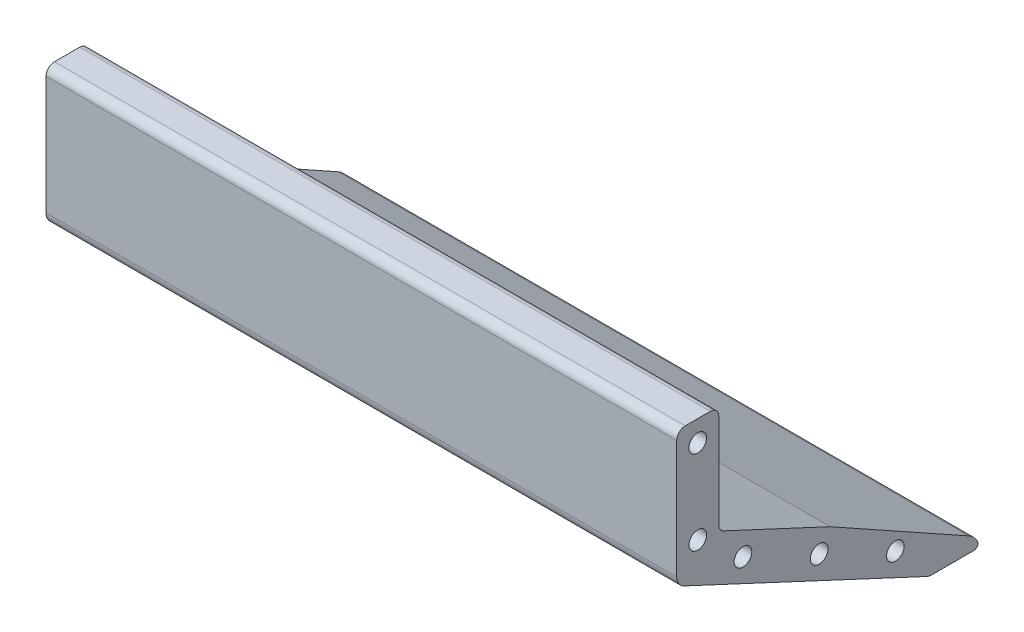
ISO-10303-21;
HEADER;
FILE_DESCRIPTION(('STEP AP214'),'2;1');
FILE_NAME('part.step','',(''),(''),'','','');
FILE_SCHEMA(('AUTOMOTIVE_DESIGN { 1 0 10303 214 1 1 1 1 }'));
ENDSEC;
DATA;
#1=APPLICATION_CONTEXT('core data for automotive mechanical design processes');
#2=APPLICATION_PROTOCOL_DEFINITION('international standard','automotive_design',2000,#1);
#3=PRODUCT_CONTEXT('',#1,'mechanical');
#4=PRODUCT('Part','Part','',(#3));
#5=PRODUCT_RELATED_PRODUCT_CATEGORY('part','',(#4));
#6=PRODUCT_DEFINITION_FORMATION('','',#4);
#7=PRODUCT_DEFINITION_CONTEXT('part definition',#1,'design');
#8=PRODUCT_DEFINITION('design','',#6,#7);
#9=PRODUCT_DEFINITION_SHAPE('','',#8);
#10=(LENGTH_UNIT() NAMED_UNIT(*) SI_UNIT(.MILLI.,.METRE.));
#11=(NAMED_UNIT(*) PLANE_ANGLE_UNIT() SI_UNIT($,.RADIAN.));
#12=(NAMED_UNIT(*) SI_UNIT($,.STERADIAN.) SOLID_ANGLE_UNIT());
#13=UNCERTAINTY_MEASURE_WITH_UNIT(LENGTH_MEASURE(1.E-05),#10,'distance_accuracy_value','');
#14=(GEOMETRIC_REPRESENTATION_CONTEXT(3) GLOBAL_UNCERTAINTY_ASSIGNED_CONTEXT((#13)) GLOBAL_UNIT_ASSIGNED_CONTEXT((#10,
#11,#12)) REPRESENTATION_CONTEXT('',''));
#15=CARTESIAN_POINT('',(0.,0.,0.));
#16=DIRECTION('',(0.,0.,1.));
#17=DIRECTION('',(1.,0.,0.));
#18=AXIS2_PLACEMENT_3D('',#15,#16,#17);
#19=CARTESIAN_POINT('',(147.,0.,0.));
#20=DIRECTION('',(1.,0.,0.));
#21=DIRECTION('',(0.,0.,-1.));
#22=AXIS2_PLACEMENT_3D('',#19,#20,#21);
#23=PLANE('',#22);
#24=CARTESIAN_POINT('',(147.,-15.,55.));
#25=DIRECTION('',(1.,0.,0.));
#26=DIRECTION('',(0.,0.,-1.));
#27=AXIS2_PLACEMENT_3D('',#24,#25,#26);
#28=CIRCLE('',#27,2.1);
#29=CARTESIAN_POINT('',(147.,-15.,52.9));
#30=VERTEX_POINT('',#29);
#31=EDGE_CURVE('E186',#30,#30,#28,.T.);
#32=ORIENTED_EDGE('',*,*,#31,.F.);
#33=EDGE_LOOP('',(#32));
#34=FACE_BOUND('',#33,.T.);
#35=CARTESIAN_POINT('',(147.,-43.8479186703194,44.2523114814659));
#36=DIRECTION('',(1.,0.,0.));
#37=DIRECTION('',(0.,0.,-1.));
#38=AXIS2_PLACEMENT_3D('',#35,#36,#37);
#39=CIRCLE('',#38,2.1);
#40=CARTESIAN_POINT('',(147.,-43.8479186703194,42.1523114814659));
#41=VERTEX_POINT('',#40);
#42=EDGE_CURVE('E176',#41,#41,#39,.T.);
#43=ORIENTED_EDGE('',*,*,#42,.F.);
#44=EDGE_LOOP('',(#43));
#45=FACE_BOUND('',#44,.T.);
#46=CARTESIAN_POINT('',(147.,-52.3002839051334,26.126155740733));
#47=DIRECTION('',(1.,0.,0.));
#48=DIRECTION('',(0.,0.,-1.));
#49=AXIS2_PLACEMENT_3D('',#46,#47,#48);
#50=CIRCLE('',#49,2.1);
#51=CARTESIAN_POINT('',(147.,-52.3002839051334,24.026155740733));
#52=VERTEX_POINT('',#51);
#53=EDGE_CURVE('E180',#52,#52,#50,.T.);
#54=ORIENTED_EDGE('',*,*,#53,.F.);
#55=EDGE_LOOP('',(#54));
#56=FACE_BOUND('',#55,.T.);
#57=CARTESIAN_POINT('',(147.,-35.,54.9999999999998));
#58=DIRECTION('',(1.,0.,0.));
#59=DIRECTION('',(0.,0.,-1.));
#60=AXIS2_PLACEMENT_3D('',#57,#58,#59);
#61=CIRCLE('',#60,2.1);
#62=CARTESIAN_POINT('',(147.,-35.,52.8999999999998));
#63=VERTEX_POINT('',#62);
#64=EDGE_CURVE('E189',#63,#63,#61,.T.);
#65=ORIENTED_EDGE('',*,*,#64,.F.);
#66=EDGE_LOOP('',(#65));
#67=FACE_BOUND('',#66,.T.);
#68=CARTESIAN_POINT('',(147.,-60.7526491399475,7.99999999999999));
#69=DIRECTION('',(1.,0.,0.));
#70=DIRECTION('',(0.,0.,-1.));
#71=AXIS2_PLACEMENT_3D('',#68,#69,#70);
#72=CIRCLE('',#71,2.1);
#73=CARTESIAN_POINT('',(147.,-60.7526491399475,5.9));
#74=VERTEX_POINT('',#73);
#75=EDGE_CURVE('E193',#74,#74,#72,.T.);
#76=ORIENTED_EDGE('',*,*,#75,.F.);
#77=EDGE_LOOP('',(#76));
#78=FACE_BOUND('',#77,.T.);
#79=DIRECTION('',(0.,0.,-1.));
#80=VECTOR('',#79,1.);
#81=CARTESIAN_POINT('',(147.,-70.,0.));
#82=LINE('',#81,#80);
#83=CARTESIAN_POINT('',(147.,-70.,-0.665083987928829));
#84=VERTEX_POINT('',#83);
#85=CARTESIAN_POINT('',(147.,-70.,-10.6466021055416));
#86=VERTEX_POINT('',#85);
#87=EDGE_CURVE('E267',#84,#86,#82,.T.);
#88=ORIENTED_EDGE('',*,*,#87,.T.);
#89=CARTESIAN_POINT('',(147.,-69.,-10.6466021055416));
#90=DIRECTION('',(1.,0.,0.));
#91=DIRECTION('',(0.,0.,-1.));
#92=AXIS2_PLACEMENT_3D('',#89,#90,#91);
#93=CIRCLE('',#92,1.);
#94=CARTESIAN_POINT('',(147.,-68.5574128617564,-11.5433276070533));
#95=VERTEX_POINT('',#94);
#96=EDGE_CURVE('E12',#86,#95,#93,.T.);
#97=ORIENTED_EDGE('',*,*,#96,.T.);
#98=CARTESIAN_POINT('',(147.,-70.7703485529743,-7.05970009949494));
#99=DIRECTION('',(1.,0.,0.));
#100=DIRECTION('',(0.,0.,-1.));
#101=AXIS2_PLACEMENT_3D('',#98,#99,#100);
#102=CIRCLE('',#101,5.);
#103=CARTESIAN_POINT('',(147.,-66.4031398071009,-9.49434335261574));
#104=VERTEX_POINT('',#103);
#105=EDGE_CURVE('E158',#95,#104,#102,.T.);
#106=ORIENTED_EDGE('',*,*,#105,.T.);
#107=DIRECTION('',(0.,0.486928650624159,0.873441749174687));
#108=VECTOR('',#107,1.);
#109=CARTESIAN_POINT('',(147.,-46.6210074199574,25.9904043460127));
#110=LINE('',#109,#108);
#111=CARTESIAN_POINT('',(147.,-48.0009642645785,23.5150685476233));
#112=VERTEX_POINT('',#111);
#113=EDGE_CURVE('E153',#104,#112,#110,.T.);
#114=ORIENTED_EDGE('',*,*,#113,.T.);
#115=DIRECTION('',(0.,-0.422618261740704,-0.906307787036648));
#116=VECTOR('',#115,1.);
#117=CARTESIAN_POINT('',(147.,-48.4344884686621,22.5853728917574));
#118=LINE('',#117,#116);
#119=CARTESIAN_POINT('',(147.,-36.1893129550832,48.8452365234814));
#120=VERTEX_POINT('',#119);
#121=EDGE_CURVE('E156',#120,#112,#118,.T.);
#122=ORIENTED_EDGE('',*,*,#121,.F.);
#123=CARTESIAN_POINT('',(147.,-34.3766973810099,48.));
#124=DIRECTION('',(1.,0.,0.));
#125=DIRECTION('',(0.,0.,-1.));
#126=AXIS2_PLACEMENT_3D('',#123,#124,#125);
#127=CIRCLE('',#126,2.);
#128=CARTESIAN_POINT('',(147.,-34.3766973810099,50.));
#129=VERTEX_POINT('',#128);
#130=EDGE_CURVE('E220',#120,#129,#127,.F.);
#131=ORIENTED_EDGE('',*,*,#130,.T.);
#132=DIRECTION('',(0.,1.,0.));
#133=VECTOR('',#132,1.);
#134=CARTESIAN_POINT('',(147.,0.,50.));
#135=LINE('',#134,#133);
#136=CARTESIAN_POINT('',(147.,-12.,50.));
#137=VERTEX_POINT('',#136);
#138=EDGE_CURVE('E177',#129,#137,#135,.T.);
#139=ORIENTED_EDGE('',*,*,#138,.T.);
#140=CARTESIAN_POINT('',(147.,-12.,52.));
#141=DIRECTION('',(1.,0.,0.));
#142=DIRECTION('',(0.,0.,-1.));
#143=AXIS2_PLACEMENT_3D('',#140,#141,#142);
#144=CIRCLE('',#143,2.);
#145=CARTESIAN_POINT('',(147.,-10.,52.));
#146=VERTEX_POINT('',#145);
#147=EDGE_CURVE('E210',#137,#146,#144,.T.);
#148=ORIENTED_EDGE('',*,*,#147,.T.);
#149=DIRECTION('',(0.,0.,-1.));
#150=VECTOR('',#149,1.);
#151=CARTESIAN_POINT('',(147.,-10.,0.));
#152=LINE('',#151,#150);
#153=CARTESIAN_POINT('',(147.,-10.,58.));
#154=VERTEX_POINT('',#153);
#155=EDGE_CURVE('E170',#154,#146,#152,.T.);
#156=ORIENTED_EDGE('',*,*,#155,.F.);
#157=CARTESIAN_POINT('',(147.,-12.,58.));
#158=DIRECTION('',(1.,0.,0.));
#159=DIRECTION('',(0.,0.,-1.));
#160=AXIS2_PLACEMENT_3D('',#157,#158,#159);
#161=CIRCLE('',#160,2.);
#162=CARTESIAN_POINT('',(147.,-12.,60.));
#163=VERTEX_POINT('',#162);
#164=EDGE_CURVE('E212',#154,#163,#161,.T.);
#165=ORIENTED_EDGE('',*,*,#164,.T.);
#166=DIRECTION('',(0.,-1.,0.));
#167=VECTOR('',#166,1.);
#168=CARTESIAN_POINT('',(147.,0.,60.));
#169=LINE('',#168,#167);
#170=CARTESIAN_POINT('',(147.,-40.1103297282773,60.));
#171=VERTEX_POINT('',#170);
#172=EDGE_CURVE('E249',#163,#171,#169,.T.);
#173=ORIENTED_EDGE('',*,*,#172,.T.);
#174=CARTESIAN_POINT('',(147.,-40.1103297282773,57.));
#175=DIRECTION('',(1.,0.,0.));
#176=DIRECTION('',(0.,0.,-1.));
#177=AXIS2_PLACEMENT_3D('',#174,#175,#176);
#178=CIRCLE('',#177,3.);
#179=CARTESIAN_POINT('',(147.,-42.8292530893872,58.2678547852221));
#180=VERTEX_POINT('',#179);
#181=EDGE_CURVE('E269',#171,#180,#178,.T.);
#182=ORIENTED_EDGE('',*,*,#181,.T.);
#183=DIRECTION('',(0.,0.422618261740704,0.906307787036648));
#184=VECTOR('',#183,1.);
#185=CARTESIAN_POINT('',(147.,-57.4975663390286,26.8115555091644));
#186=LINE('',#185,#184);
#187=CARTESIAN_POINT('',(147.,-69.7189233611099,0.602770797293282));
#188=VERTEX_POINT('',#187);
#189=EDGE_CURVE('E290',#188,#180,#186,.T.);
#190=ORIENTED_EDGE('',*,*,#189,.F.);
#191=CARTESIAN_POINT('',(147.,-67.,-0.665083987928829));
#192=DIRECTION('',(1.,0.,0.));
#193=DIRECTION('',(0.,0.,-1.));
#194=AXIS2_PLACEMENT_3D('',#191,#192,#193);
#195=CIRCLE('',#194,3.);
#196=EDGE_CURVE('E274',#188,#84,#195,.T.);
#197=ORIENTED_EDGE('',*,*,#196,.T.);
#198=EDGE_LOOP('',(#88,#97,#106,#114,#122,#131,#139,#148,#156,#165,#173,#182,#190,#197));
#199=FACE_BOUND('',#198,.T.);
#200=ADVANCED_FACE('F52',(#34,#45,#56,#67,#78,#199),#23,.T.);
#201=CARTESIAN_POINT('',(-3.,0.,0.));
#202=DIRECTION('',(1.,0.,0.));
#203=DIRECTION('',(0.,0.,-1.));
#204=AXIS2_PLACEMENT_3D('',#201,#202,#203);
#205=PLANE('',#204);
#206=CARTESIAN_POINT('',(-3.,-60.7526491399475,7.99999999999999));
#207=DIRECTION('',(1.,0.,0.));
#208=DIRECTION('',(0.,0.,-1.));
#209=AXIS2_PLACEMENT_3D('',#206,#207,#208);
#210=CIRCLE('',#209,2.1);
#211=CARTESIAN_POINT('',(-3.,-60.7526491399475,5.9));
#212=VERTEX_POINT('',#211);
#213=EDGE_CURVE('E188',#212,#212,#210,.T.);
#214=ORIENTED_EDGE('',*,*,#213,.T.);
#215=EDGE_LOOP('',(#214));
#216=FACE_BOUND('',#215,.T.);
#217=CARTESIAN_POINT('',(-3.,-35.,54.9999999999998));
#218=DIRECTION('',(1.,0.,0.));
#219=DIRECTION('',(0.,0.,-1.));
#220=AXIS2_PLACEMENT_3D('',#217,#218,#219);
#221=CIRCLE('',#220,2.1);
#222=CARTESIAN_POINT('',(-3.,-35.,52.8999999999998));
#223=VERTEX_POINT('',#222);
#224=EDGE_CURVE('E252',#223,#223,#221,.T.);
#225=ORIENTED_EDGE('',*,*,#224,.T.);
#226=EDGE_LOOP('',(#225));
#227=FACE_BOUND('',#226,.T.);
#228=CARTESIAN_POINT('',(-3.,-52.3002839051334,26.126155740733));
#229=DIRECTION('',(1.,0.,0.));
#230=DIRECTION('',(0.,0.,-1.));
#231=AXIS2_PLACEMENT_3D('',#228,#229,#230);
#232=CIRCLE('',#231,2.1);
#233=CARTESIAN_POINT('',(-3.,-52.3002839051334,24.026155740733));
#234=VERTEX_POINT('',#233);
#235=EDGE_CURVE('E255',#234,#234,#232,.T.);
#236=ORIENTED_EDGE('',*,*,#235,.T.);
#237=EDGE_LOOP('',(#236));
#238=FACE_BOUND('',#237,.T.);
#239=CARTESIAN_POINT('',(-3.,-43.8479186703194,44.2523114814659));
#240=DIRECTION('',(1.,0.,0.));
#241=DIRECTION('',(0.,0.,-1.));
#242=AXIS2_PLACEMENT_3D('',#239,#240,#241);
#243=CIRCLE('',#242,2.1);
#244=CARTESIAN_POINT('',(-3.,-43.8479186703194,42.1523114814659));
#245=VERTEX_POINT('',#244);
#246=EDGE_CURVE('E258',#245,#245,#243,.T.);
#247=ORIENTED_EDGE('',*,*,#246,.T.);
#248=EDGE_LOOP('',(#247));
#249=FACE_BOUND('',#248,.T.);
#250=CARTESIAN_POINT('',(-3.,-15.,55.));
#251=DIRECTION('',(1.,0.,0.));
#252=DIRECTION('',(0.,0.,-1.));
#253=AXIS2_PLACEMENT_3D('',#250,#251,#252);
#254=CIRCLE('',#253,2.1);
#255=CARTESIAN_POINT('',(-3.,-15.,52.9));
#256=VERTEX_POINT('',#255);
#257=EDGE_CURVE('E244',#256,#256,#254,.T.);
#258=ORIENTED_EDGE('',*,*,#257,.T.);
#259=EDGE_LOOP('',(#258));
#260=FACE_BOUND('',#259,.T.);
#261=CARTESIAN_POINT('',(-3.,-70.7703485529743,-7.05970009949494));
#262=DIRECTION('',(1.,0.,0.));
#263=DIRECTION('',(0.,0.,-1.));
#264=AXIS2_PLACEMENT_3D('',#261,#262,#263);
#265=CIRCLE('',#264,5.);
#266=CARTESIAN_POINT('',(-3.,-66.4031398071009,-9.49434335261573));
#267=VERTEX_POINT('',#266);
#268=CARTESIAN_POINT('',(-3.,-68.5574128617564,-11.5433276070533));
#269=VERTEX_POINT('',#268);
#270=EDGE_CURVE('E227',#267,#269,#265,.F.);
#271=ORIENTED_EDGE('',*,*,#270,.T.);
#272=CARTESIAN_POINT('',(-3.,-69.,-10.6466021055416));
#273=DIRECTION('',(1.,0.,0.));
#274=DIRECTION('',(0.,0.,-1.));
#275=AXIS2_PLACEMENT_3D('',#272,#273,#274);
#276=CIRCLE('',#275,1.);
#277=CARTESIAN_POINT('',(-3.,-70.,-10.6466021055416));
#278=VERTEX_POINT('',#277);
#279=EDGE_CURVE('E74',#269,#278,#276,.F.);
#280=ORIENTED_EDGE('',*,*,#279,.T.);
#281=DIRECTION('',(0.,0.,-1.));
#282=VECTOR('',#281,1.);
#283=CARTESIAN_POINT('',(-3.,-70.,0.));
#284=LINE('',#283,#282);
#285=CARTESIAN_POINT('',(-3.,-70.,-0.665083987928829));
#286=VERTEX_POINT('',#285);
#287=EDGE_CURVE('E247',#286,#278,#284,.T.);
#288=ORIENTED_EDGE('',*,*,#287,.F.);
#289=CARTESIAN_POINT('',(-3.,-67.,-0.665083987928829));
#290=DIRECTION('',(1.,0.,0.));
#291=DIRECTION('',(0.,0.,-1.));
#292=AXIS2_PLACEMENT_3D('',#289,#290,#291);
#293=CIRCLE('',#292,3.);
#294=CARTESIAN_POINT('',(-3.,-69.7189233611099,0.602770797293283));
#295=VERTEX_POINT('',#294);
#296=EDGE_CURVE('E266',#286,#295,#293,.F.);
#297=ORIENTED_EDGE('',*,*,#296,.T.);
#298=DIRECTION('',(0.,0.422618261740704,0.906307787036648));
#299=VECTOR('',#298,1.);
#300=CARTESIAN_POINT('',(-3.,-57.4975663390286,26.8115555091644));
#301=LINE('',#300,#299);
#302=CARTESIAN_POINT('',(-3.,-42.8292530893872,58.2678547852221));
#303=VERTEX_POINT('',#302);
#304=EDGE_CURVE('E243',#295,#303,#301,.T.);
#305=ORIENTED_EDGE('',*,*,#304,.T.);
#306=CARTESIAN_POINT('',(-3.,-40.1103297282773,57.));
#307=DIRECTION('',(1.,0.,0.));
#308=DIRECTION('',(0.,0.,-1.));
#309=AXIS2_PLACEMENT_3D('',#306,#307,#308);
#310=CIRCLE('',#309,3.);
#311=CARTESIAN_POINT('',(-3.,-40.1103297282773,60.));
#312=VERTEX_POINT('',#311);
#313=EDGE_CURVE('E263',#303,#312,#310,.F.);
#314=ORIENTED_EDGE('',*,*,#313,.T.);
#315=DIRECTION('',(0.,-1.,0.));
#316=VECTOR('',#315,1.);
#317=CARTESIAN_POINT('',(-3.,0.,60.));
#318=LINE('',#317,#316);
#319=CARTESIAN_POINT('',(-3.,-12.,60.));
#320=VERTEX_POINT('',#319);
#321=EDGE_CURVE('E241',#320,#312,#318,.T.);
#322=ORIENTED_EDGE('',*,*,#321,.F.);
#323=CARTESIAN_POINT('',(-3.,-12.,58.));
#324=DIRECTION('',(1.,0.,0.));
#325=DIRECTION('',(0.,0.,-1.));
#326=AXIS2_PLACEMENT_3D('',#323,#324,#325);
#327=CIRCLE('',#326,2.);
#328=CARTESIAN_POINT('',(-3.,-10.,58.));
#329=VERTEX_POINT('',#328);
#330=EDGE_CURVE('E218',#320,#329,#327,.F.);
#331=ORIENTED_EDGE('',*,*,#330,.T.);
#332=DIRECTION('',(0.,0.,-1.));
#333=VECTOR('',#332,1.);
#334=CARTESIAN_POINT('',(-3.,-10.,0.));
#335=LINE('',#334,#333);
#336=CARTESIAN_POINT('',(-3.,-10.,52.));
#337=VERTEX_POINT('',#336);
#338=EDGE_CURVE('E282',#329,#337,#335,.T.);
#339=ORIENTED_EDGE('',*,*,#338,.T.);
#340=CARTESIAN_POINT('',(-3.,-12.,52.));
#341=DIRECTION('',(1.,0.,0.));
#342=DIRECTION('',(0.,0.,-1.));
#343=AXIS2_PLACEMENT_3D('',#340,#341,#342);
#344=CIRCLE('',#343,2.);
#345=CARTESIAN_POINT('',(-3.,-12.,50.));
#346=VERTEX_POINT('',#345);
#347=EDGE_CURVE('E216',#337,#346,#344,.F.);
#348=ORIENTED_EDGE('',*,*,#347,.T.);
#349=DIRECTION('',(0.,1.,0.));
#350=VECTOR('',#349,1.);
#351=CARTESIAN_POINT('',(-3.,0.,50.));
#352=LINE('',#351,#350);
#353=CARTESIAN_POINT('',(-3.,-34.3766973810099,50.));
#354=VERTEX_POINT('',#353);
#355=EDGE_CURVE('E285',#354,#346,#352,.T.);
#356=ORIENTED_EDGE('',*,*,#355,.F.);
#357=CARTESIAN_POINT('',(-3.,-34.3766973810099,48.));
#358=DIRECTION('',(1.,0.,0.));
#359=DIRECTION('',(0.,0.,-1.));
#360=AXIS2_PLACEMENT_3D('',#357,#358,#359);
#361=CIRCLE('',#360,2.);
#362=CARTESIAN_POINT('',(-3.,-36.1893129550832,48.8452365234814));
#363=VERTEX_POINT('',#362);
#364=EDGE_CURVE('E222',#354,#363,#361,.T.);
#365=ORIENTED_EDGE('',*,*,#364,.T.);
#366=DIRECTION('',(0.,-0.422618261740704,-0.906307787036648));
#367=VECTOR('',#366,1.);
#368=CARTESIAN_POINT('',(-3.,-48.4344884686621,22.5853728917574));
#369=LINE('',#368,#367);
#370=CARTESIAN_POINT('',(-3.,-48.0009642645784,23.5150685476233));
#371=VERTEX_POINT('',#370);
#372=EDGE_CURVE('E200',#363,#371,#369,.T.);
#373=ORIENTED_EDGE('',*,*,#372,.T.);
#374=DIRECTION('',(0.,0.486928650624159,0.873441749174687));
#375=VECTOR('',#374,1.);
#376=CARTESIAN_POINT('',(-3.,-46.6210074199574,25.9904043460127));
#377=LINE('',#376,#375);
#378=EDGE_CURVE('E161',#267,#371,#377,.T.);
#379=ORIENTED_EDGE('',*,*,#378,.F.);
#380=EDGE_LOOP('',(#271,#280,#288,#297,#305,#314,#322,#331,#339,#348,#356,#365,#373,#379));
#381=FACE_BOUND('',#380,.T.);
#382=ADVANCED_FACE('F238',(#216,#227,#238,#249,#260,#381),#205,.F.);
#383=CARTESIAN_POINT('',(-7.,-48.4344884686621,22.5853728917574));
#384=DIRECTION('',(0.,-0.906307787036648,0.422618261740704));
#385=DIRECTION('',(0.,-0.422618261740704,-0.906307787036648));
#386=AXIS2_PLACEMENT_3D('',#383,#384,#385);
#387=PLANE('',#386);
#388=DIRECTION('',(1.,0.,0.));
#389=VECTOR('',#388,1.);
#390=CARTESIAN_POINT('',(-3.,-48.0009642645785,23.5150685476233));
#391=LINE('',#390,#389);
#392=EDGE_CURVE('E164',#371,#112,#391,.T.);
#393=ORIENTED_EDGE('',*,*,#392,.F.);
#394=ORIENTED_EDGE('',*,*,#372,.F.);
#395=DIRECTION('',(1.,0.,0.));
#396=VECTOR('',#395,1.);
#397=CARTESIAN_POINT('',(-7.,-36.1893129550832,48.8452365234814));
#398=LINE('',#397,#396);
#399=EDGE_CURVE('E175',#363,#120,#398,.T.);
#400=ORIENTED_EDGE('',*,*,#399,.T.);
#401=ORIENTED_EDGE('',*,*,#121,.T.);
#402=EDGE_LOOP('',(#393,#394,#400,#401));
#403=FACE_BOUND('',#402,.T.);
#404=ADVANCED_FACE('F173',(#403),#387,.F.);
#405=CARTESIAN_POINT('',(3.,0.,60.));
#406=DIRECTION('',(0.,0.,-1.));
#407=DIRECTION('',(0.,1.,0.));
#408=AXIS2_PLACEMENT_3D('',#405,#406,#407);
#409=PLANE('',#408);
#410=ORIENTED_EDGE('',*,*,#172,.F.);
#411=DIRECTION('',(1.,0.,0.));
#412=VECTOR('',#411,1.);
#413=CARTESIAN_POINT('',(3.,-12.,60.));
#414=LINE('',#413,#412);
#415=EDGE_CURVE('E214',#163,#320,#414,.F.);
#416=ORIENTED_EDGE('',*,*,#415,.T.);
#417=ORIENTED_EDGE('',*,*,#321,.T.);
#418=DIRECTION('',(-1.,0.,0.));
#419=VECTOR('',#418,1.);
#420=CARTESIAN_POINT('',(3.,-40.1103297282773,60.));
#421=LINE('',#420,#419);
#422=EDGE_CURVE('E279',#312,#171,#421,.F.);
#423=ORIENTED_EDGE('',*,*,#422,.T.);
#424=EDGE_LOOP('',(#410,#416,#417,#423));
#425=FACE_BOUND('',#424,.T.);
#426=ADVANCED_FACE('F345',(#425),#409,.F.);
#427=CARTESIAN_POINT('',(3.,-57.4975663390286,26.8115555091644));
#428=DIRECTION('',(0.,-0.906307787036648,0.422618261740704));
#429=DIRECTION('',(0.,-0.422618261740704,-0.906307787036648));
#430=AXIS2_PLACEMENT_3D('',#427,#428,#429);
#431=PLANE('',#430);
#432=ORIENTED_EDGE('',*,*,#304,.F.);
#433=DIRECTION('',(-1.,0.,0.));
#434=VECTOR('',#433,1.);
#435=CARTESIAN_POINT('',(3.,-69.7189233611099,0.602770797293282));
#436=LINE('',#435,#434);
#437=EDGE_CURVE('E277',#295,#188,#436,.F.);
#438=ORIENTED_EDGE('',*,*,#437,.T.);
#439=ORIENTED_EDGE('',*,*,#189,.T.);
#440=DIRECTION('',(-1.,0.,0.));
#441=VECTOR('',#440,1.);
#442=CARTESIAN_POINT('',(-3.,-42.8292530893872,58.2678547852221));
#443=LINE('',#442,#441);
#444=EDGE_CURVE('E273',#180,#303,#443,.T.);
#445=ORIENTED_EDGE('',*,*,#444,.T.);
#446=EDGE_LOOP('',(#432,#438,#439,#445));
#447=FACE_BOUND('',#446,.T.);
#448=ADVANCED_FACE('F348',(#447),#431,.T.);
#449=CARTESIAN_POINT('',(3.,-70.,0.));
#450=DIRECTION('',(0.,1.,0.));
#451=DIRECTION('',(0.,0.,1.));
#452=AXIS2_PLACEMENT_3D('',#449,#450,#451);
#453=PLANE('',#452);
#454=ORIENTED_EDGE('',*,*,#287,.T.);
#455=DIRECTION('',(1.,0.,0.));
#456=VECTOR('',#455,1.);
#457=CARTESIAN_POINT('',(147.,-70.,-10.6466021055416));
#458=LINE('',#457,#456);
#459=EDGE_CURVE('E60',#278,#86,#458,.T.);
#460=ORIENTED_EDGE('',*,*,#459,.T.);
#461=ORIENTED_EDGE('',*,*,#87,.F.);
#462=DIRECTION('',(-1.,0.,0.));
#463=VECTOR('',#462,1.);
#464=CARTESIAN_POINT('',(-3.,-70.,-0.665083987928829));
#465=LINE('',#464,#463);
#466=EDGE_CURVE('E270',#84,#286,#465,.T.);
#467=ORIENTED_EDGE('',*,*,#466,.T.);
#468=EDGE_LOOP('',(#454,#460,#461,#467));
#469=FACE_BOUND('',#468,.T.);
#470=ADVANCED_FACE('F352',(#469),#453,.F.);
#471=CARTESIAN_POINT('',(-7.,-60.7526491399475,7.99999999999999));
#472=DIRECTION('',(1.,0.,0.));
#473=DIRECTION('',(0.,0.,-1.));
#474=AXIS2_PLACEMENT_3D('',#471,#472,#473);
#475=CYLINDRICAL_SURFACE('',#474,2.1);
#476=ORIENTED_EDGE('',*,*,#75,.T.);
#477=EDGE_LOOP('',(#476));
#478=FACE_BOUND('',#477,.T.);
#479=ORIENTED_EDGE('',*,*,#213,.F.);
#480=EDGE_LOOP('',(#479));
#481=FACE_BOUND('',#480,.T.);
#482=ADVANCED_FACE('F355',(#478,#481),#475,.F.);
#483=CARTESIAN_POINT('',(-7.,-35.,54.9999999999998));
#484=DIRECTION('',(1.,0.,0.));
#485=DIRECTION('',(0.,0.,-1.));
#486=AXIS2_PLACEMENT_3D('',#483,#484,#485);
#487=CYLINDRICAL_SURFACE('',#486,2.1);
#488=ORIENTED_EDGE('',*,*,#64,.T.);
#489=EDGE_LOOP('',(#488));
#490=FACE_BOUND('',#489,.T.);
#491=ORIENTED_EDGE('',*,*,#224,.F.);
#492=EDGE_LOOP('',(#491));
#493=FACE_BOUND('',#492,.T.);
#494=ADVANCED_FACE('F357',(#490,#493),#487,.F.);
#495=CARTESIAN_POINT('',(-7.,-52.3002839051334,26.126155740733));
#496=DIRECTION('',(1.,0.,0.));
#497=DIRECTION('',(0.,0.,-1.));
#498=AXIS2_PLACEMENT_3D('',#495,#496,#497);
#499=CYLINDRICAL_SURFACE('',#498,2.1);
#500=ORIENTED_EDGE('',*,*,#53,.T.);
#501=EDGE_LOOP('',(#500));
#502=FACE_BOUND('',#501,.T.);
#503=ORIENTED_EDGE('',*,*,#235,.F.);
#504=EDGE_LOOP('',(#503));
#505=FACE_BOUND('',#504,.T.);
#506=ADVANCED_FACE('F360',(#502,#505),#499,.F.);
#507=CARTESIAN_POINT('',(-7.,-43.8479186703194,44.2523114814659));
#508=DIRECTION('',(1.,0.,0.));
#509=DIRECTION('',(0.,0.,-1.));
#510=AXIS2_PLACEMENT_3D('',#507,#508,#509);
#511=CYLINDRICAL_SURFACE('',#510,2.1);
#512=ORIENTED_EDGE('',*,*,#42,.T.);
#513=EDGE_LOOP('',(#512));
#514=FACE_BOUND('',#513,.T.);
#515=ORIENTED_EDGE('',*,*,#246,.F.);
#516=EDGE_LOOP('',(#515));
#517=FACE_BOUND('',#516,.T.);
#518=ADVANCED_FACE('F365',(#514,#517),#511,.F.);
#519=CARTESIAN_POINT('',(-7.,-15.,55.));
#520=DIRECTION('',(1.,0.,0.));
#521=DIRECTION('',(0.,0.,-1.));
#522=AXIS2_PLACEMENT_3D('',#519,#520,#521);
#523=CYLINDRICAL_SURFACE('',#522,2.1);
#524=ORIENTED_EDGE('',*,*,#31,.T.);
#525=EDGE_LOOP('',(#524));
#526=FACE_BOUND('',#525,.T.);
#527=ORIENTED_EDGE('',*,*,#257,.F.);
#528=EDGE_LOOP('',(#527));
#529=FACE_BOUND('',#528,.T.);
#530=ADVANCED_FACE('F343',(#526,#529),#523,.F.);
#531=CARTESIAN_POINT('',(3.,-67.,-0.665083987928829));
#532=DIRECTION('',(1.,0.,0.));
#533=DIRECTION('',(0.,0.,-1.));
#534=AXIS2_PLACEMENT_3D('',#531,#532,#533);
#535=CYLINDRICAL_SURFACE('',#534,3.);
#536=ORIENTED_EDGE('',*,*,#196,.F.);
#537=ORIENTED_EDGE('',*,*,#437,.F.);
#538=ORIENTED_EDGE('',*,*,#296,.F.);
#539=ORIENTED_EDGE('',*,*,#466,.F.);
#540=EDGE_LOOP('',(#536,#537,#538,#539));
#541=FACE_BOUND('',#540,.T.);
#542=ADVANCED_FACE('F339',(#541),#535,.T.);
#543=CARTESIAN_POINT('',(3.,-40.1103297282773,57.));
#544=DIRECTION('',(1.,0.,0.));
#545=DIRECTION('',(0.,0.,-1.));
#546=AXIS2_PLACEMENT_3D('',#543,#544,#545);
#547=CYLINDRICAL_SURFACE('',#546,3.);
#548=ORIENTED_EDGE('',*,*,#181,.F.);
#549=ORIENTED_EDGE('',*,*,#422,.F.);
#550=ORIENTED_EDGE('',*,*,#313,.F.);
#551=ORIENTED_EDGE('',*,*,#444,.F.);
#552=EDGE_LOOP('',(#548,#549,#550,#551));
#553=FACE_BOUND('',#552,.T.);
#554=ADVANCED_FACE('F336',(#553),#547,.T.);
#555=CARTESIAN_POINT('',(-7.,0.,50.));
#556=DIRECTION('',(0.,0.,-1.));
#557=DIRECTION('',(-1.,0.,0.));
#558=AXIS2_PLACEMENT_3D('',#555,#556,#557);
#559=PLANE('',#558);
#560=ORIENTED_EDGE('',*,*,#138,.F.);
#561=DIRECTION('',(1.,0.,0.));
#562=VECTOR('',#561,1.);
#563=CARTESIAN_POINT('',(-7.,-34.3766973810099,50.));
#564=LINE('',#563,#562);
#565=EDGE_CURVE('E203',#129,#354,#564,.F.);
#566=ORIENTED_EDGE('',*,*,#565,.T.);
#567=ORIENTED_EDGE('',*,*,#355,.T.);
#568=DIRECTION('',(1.,0.,0.));
#569=VECTOR('',#568,1.);
#570=CARTESIAN_POINT('',(147.,-12.,50.));
#571=LINE('',#570,#569);
#572=EDGE_CURVE('E199',#346,#137,#571,.T.);
#573=ORIENTED_EDGE('',*,*,#572,.T.);
#574=EDGE_LOOP('',(#560,#566,#567,#573));
#575=FACE_BOUND('',#574,.T.);
#576=ADVANCED_FACE('F310',(#575),#559,.T.);
#577=CARTESIAN_POINT('',(-7.,-10.,0.));
#578=DIRECTION('',(0.,-1.,0.));
#579=DIRECTION('',(0.,0.,-1.));
#580=AXIS2_PLACEMENT_3D('',#577,#578,#579);
#581=PLANE('',#580);
#582=ORIENTED_EDGE('',*,*,#338,.F.);
#583=DIRECTION('',(1.,0.,0.));
#584=VECTOR('',#583,1.);
#585=CARTESIAN_POINT('',(-7.,-10.,58.));
#586=LINE('',#585,#584);
#587=EDGE_CURVE('E207',#329,#154,#586,.T.);
#588=ORIENTED_EDGE('',*,*,#587,.T.);
#589=ORIENTED_EDGE('',*,*,#155,.T.);
#590=DIRECTION('',(1.,0.,0.));
#591=VECTOR('',#590,1.);
#592=CARTESIAN_POINT('',(-3.,-10.,52.));
#593=LINE('',#592,#591);
#594=EDGE_CURVE('E205',#146,#337,#593,.F.);
#595=ORIENTED_EDGE('',*,*,#594,.T.);
#596=EDGE_LOOP('',(#582,#588,#589,#595));
#597=FACE_BOUND('',#596,.T.);
#598=ADVANCED_FACE('F300',(#597),#581,.F.);
#599=CARTESIAN_POINT('',(-7.,-34.3766973810099,48.));
#600=DIRECTION('',(1.,0.,0.));
#601=DIRECTION('',(0.,0.,-1.));
#602=AXIS2_PLACEMENT_3D('',#599,#600,#601);
#603=CYLINDRICAL_SURFACE('',#602,2.);
#604=ORIENTED_EDGE('',*,*,#364,.F.);
#605=ORIENTED_EDGE('',*,*,#565,.F.);
#606=ORIENTED_EDGE('',*,*,#130,.F.);
#607=ORIENTED_EDGE('',*,*,#399,.F.);
#608=EDGE_LOOP('',(#604,#605,#606,#607));
#609=FACE_BOUND('',#608,.T.);
#610=ADVANCED_FACE('F313',(#609),#603,.F.);
#611=CARTESIAN_POINT('',(-7.,-12.,58.));
#612=DIRECTION('',(1.,0.,0.));
#613=DIRECTION('',(0.,0.,-1.));
#614=AXIS2_PLACEMENT_3D('',#611,#612,#613);
#615=CYLINDRICAL_SURFACE('',#614,2.);
#616=ORIENTED_EDGE('',*,*,#330,.F.);
#617=ORIENTED_EDGE('',*,*,#415,.F.);
#618=ORIENTED_EDGE('',*,*,#164,.F.);
#619=ORIENTED_EDGE('',*,*,#587,.F.);
#620=EDGE_LOOP('',(#616,#617,#618,#619));
#621=FACE_BOUND('',#620,.T.);
#622=ADVANCED_FACE('F315',(#621),#615,.T.);
#623=CARTESIAN_POINT('',(-7.,-12.,52.));
#624=DIRECTION('',(-1.,0.,0.));
#625=DIRECTION('',(0.,0.,1.));
#626=AXIS2_PLACEMENT_3D('',#623,#624,#625);
#627=CYLINDRICAL_SURFACE('',#626,2.);
#628=ORIENTED_EDGE('',*,*,#347,.F.);
#629=ORIENTED_EDGE('',*,*,#594,.F.);
#630=ORIENTED_EDGE('',*,*,#147,.F.);
#631=ORIENTED_EDGE('',*,*,#572,.F.);
#632=EDGE_LOOP('',(#628,#629,#630,#631));
#633=FACE_BOUND('',#632,.T.);
#634=ADVANCED_FACE('F304',(#633),#627,.T.);
#635=CARTESIAN_POINT('',(-3.,-46.6210074199574,25.9904043460127));
#636=DIRECTION('',(0.,0.873441749174687,-0.486928650624159));
#637=DIRECTION('',(0.,0.486928650624159,0.873441749174687));
#638=AXIS2_PLACEMENT_3D('',#635,#636,#637);
#639=PLANE('',#638);
#640=ORIENTED_EDGE('',*,*,#113,.F.);
#641=DIRECTION('',(1.,0.,0.));
#642=VECTOR('',#641,1.);
#643=CARTESIAN_POINT('',(-3.,-66.4031398071009,-9.49434335261573));
#644=LINE('',#643,#642);
#645=EDGE_CURVE('E225',#104,#267,#644,.F.);
#646=ORIENTED_EDGE('',*,*,#645,.T.);
#647=ORIENTED_EDGE('',*,*,#378,.T.);
#648=ORIENTED_EDGE('',*,*,#392,.T.);
#649=EDGE_LOOP('',(#640,#646,#647,#648));
#650=FACE_BOUND('',#649,.T.);
#651=ADVANCED_FACE('F165',(#650),#639,.T.);
#652=CARTESIAN_POINT('',(3.,-70.7703485529743,-7.05970009949494));
#653=DIRECTION('',(-1.,0.,0.));
#654=DIRECTION('',(0.,0.,1.));
#655=AXIS2_PLACEMENT_3D('',#652,#653,#654);
#656=CYLINDRICAL_SURFACE('',#655,5.);
#657=ORIENTED_EDGE('',*,*,#105,.F.);
#658=DIRECTION('',(-1.,0.,0.));
#659=VECTOR('',#658,1.);
#660=CARTESIAN_POINT('',(3.,-68.5574128617564,-11.5433276070533));
#661=LINE('',#660,#659);
#662=EDGE_CURVE('E229',#95,#269,#661,.T.);
#663=ORIENTED_EDGE('',*,*,#662,.T.);
#664=ORIENTED_EDGE('',*,*,#270,.F.);
#665=ORIENTED_EDGE('',*,*,#645,.F.);
#666=EDGE_LOOP('',(#657,#663,#664,#665));
#667=FACE_BOUND('',#666,.T.);
#668=ADVANCED_FACE('F235',(#667),#656,.T.);
#669=CARTESIAN_POINT('',(3.,-69.,-10.6466021055416));
#670=DIRECTION('',(-1.,0.,0.));
#671=DIRECTION('',(0.,0.,1.));
#672=AXIS2_PLACEMENT_3D('',#669,#670,#671);
#673=CYLINDRICAL_SURFACE('',#672,1.);
#674=ORIENTED_EDGE('',*,*,#96,.F.);
#675=ORIENTED_EDGE('',*,*,#459,.F.);
#676=ORIENTED_EDGE('',*,*,#279,.F.);
#677=ORIENTED_EDGE('',*,*,#662,.F.);
#678=EDGE_LOOP('',(#674,#675,#676,#677));
#679=FACE_BOUND('',#678,.T.);
#680=ADVANCED_FACE('F54',(#679),#673,.T.);
#681=CLOSED_SHELL('',(#200,#382,#404,#426,#448,#470,#482,#494,#506,#518,#530,#542,#554,#576,
#598,#610,#622,#634,#651,#668,#680));
#682=MANIFOLD_SOLID_BREP('B2',#681);
#683=ADVANCED_BREP_SHAPE_REPRESENTATION('',(#18,#682),#14);
#684=SHAPE_DEFINITION_REPRESENTATION(#9,#683);
ENDSEC;
END-ISO-10303-21;
